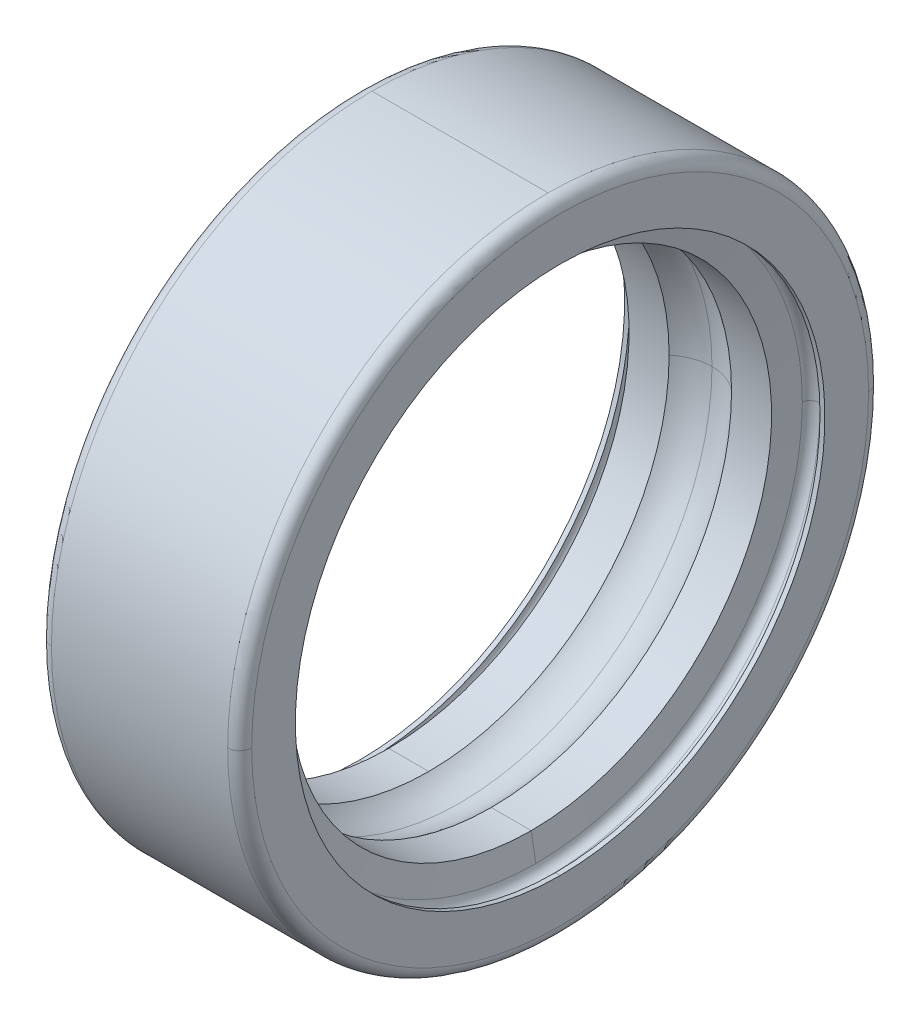
ISO-10303-21;
HEADER;
FILE_DESCRIPTION(('STEP AP214'),'2;1');
FILE_NAME('part.step','',(''),(''),'','','');
FILE_SCHEMA(('AUTOMOTIVE_DESIGN { 1 0 10303 214 1 1 1 1 }'));
ENDSEC;
DATA;
#1=APPLICATION_CONTEXT('core data for automotive mechanical design processes');
#2=APPLICATION_PROTOCOL_DEFINITION('international standard','automotive_design',2000,#1);
#3=PRODUCT_CONTEXT('',#1,'mechanical');
#4=PRODUCT('Part','Part','',(#3));
#5=PRODUCT_RELATED_PRODUCT_CATEGORY('part','',(#4));
#6=PRODUCT_DEFINITION_FORMATION('','',#4);
#7=PRODUCT_DEFINITION_CONTEXT('part definition',#1,'design');
#8=PRODUCT_DEFINITION('design','',#6,#7);
#9=PRODUCT_DEFINITION_SHAPE('','',#8);
#10=(LENGTH_UNIT() NAMED_UNIT(*) SI_UNIT(.MILLI.,.METRE.));
#11=(NAMED_UNIT(*) PLANE_ANGLE_UNIT() SI_UNIT($,.RADIAN.));
#12=(NAMED_UNIT(*) SI_UNIT($,.STERADIAN.) SOLID_ANGLE_UNIT());
#13=UNCERTAINTY_MEASURE_WITH_UNIT(LENGTH_MEASURE(1.E-05),#10,'distance_accuracy_value','');
#14=(GEOMETRIC_REPRESENTATION_CONTEXT(3) GLOBAL_UNCERTAINTY_ASSIGNED_CONTEXT((#13)) GLOBAL_UNIT_ASSIGNED_CONTEXT((#10,
#11,#12)) REPRESENTATION_CONTEXT('',''));
#15=CARTESIAN_POINT('',(0.,0.,0.));
#16=DIRECTION('',(0.,0.,1.));
#17=DIRECTION('',(1.,0.,0.));
#18=AXIS2_PLACEMENT_3D('',#15,#16,#17);
#19=CARTESIAN_POINT('',(4.634,0.,0.));
#20=DIRECTION('',(1.,0.,0.));
#21=DIRECTION('',(0.,0.,-1.));
#22=AXIS2_PLACEMENT_3D('',#19,#20,#21);
#23=TOROIDAL_SURFACE('',#22,6.61,0.244);
#24=CARTESIAN_POINT('',(4.634,0.,0.));
#25=DIRECTION('',(1.,0.,0.));
#26=DIRECTION('',(0.,0.,1.));
#27=AXIS2_PLACEMENT_3D('',#24,#25,#26);
#28=CIRCLE('',#27,6.854);
#29=CARTESIAN_POINT('',(4.634,0.,-6.854));
#30=VERTEX_POINT('',#29);
#31=CARTESIAN_POINT('',(4.634,0.,6.854));
#32=VERTEX_POINT('',#31);
#33=EDGE_CURVE('E184',#30,#32,#28,.T.);
#34=ORIENTED_EDGE('',*,*,#33,.T.);
#35=CARTESIAN_POINT('',(4.634,0.,6.61));
#36=DIRECTION('',(0.,-1.,0.));
#37=DIRECTION('',(0.,0.,1.));
#38=AXIS2_PLACEMENT_3D('',#35,#36,#37);
#39=CIRCLE('',#38,0.244);
#40=CARTESIAN_POINT('',(4.39370690826502,0.,6.65237015535073));
#41=VERTEX_POINT('',#40);
#42=EDGE_CURVE('E197',#32,#41,#39,.T.);
#43=ORIENTED_EDGE('',*,*,#42,.T.);
#44=CARTESIAN_POINT('',(4.39370690826502,0.,0.));
#45=DIRECTION('',(1.,0.,0.));
#46=DIRECTION('',(0.,1.,0.));
#47=AXIS2_PLACEMENT_3D('',#44,#45,#46);
#48=CIRCLE('',#47,6.65237015535073);
#49=CARTESIAN_POINT('',(4.39370690826502,6.65237015535073,0.));
#50=VERTEX_POINT('',#49);
#51=EDGE_CURVE('E31',#50,#41,#48,.T.);
#52=ORIENTED_EDGE('',*,*,#51,.F.);
#53=CARTESIAN_POINT('',(4.39370690826502,0.,0.));
#54=DIRECTION('',(1.,0.,0.));
#55=DIRECTION('',(0.,1.,0.));
#56=AXIS2_PLACEMENT_3D('',#53,#54,#55);
#57=CIRCLE('',#56,6.65237015535073);
#58=CARTESIAN_POINT('',(4.39370690826502,0.,-6.65237015535073));
#59=VERTEX_POINT('',#58);
#60=EDGE_CURVE('E185',#59,#50,#57,.T.);
#61=ORIENTED_EDGE('',*,*,#60,.F.);
#62=CARTESIAN_POINT('',(4.634,0.,-6.61));
#63=DIRECTION('',(0.,-1.,0.));
#64=DIRECTION('',(0.,0.,-1.));
#65=AXIS2_PLACEMENT_3D('',#62,#63,#64);
#66=CIRCLE('',#65,0.244);
#67=EDGE_CURVE('E181',#59,#30,#66,.T.);
#68=ORIENTED_EDGE('',*,*,#67,.T.);
#69=EDGE_LOOP('',(#34,#43,#52,#61,#68));
#70=FACE_BOUND('',#69,.T.);
#71=ADVANCED_FACE('F16',(#70),#23,.F.);
#72=CARTESIAN_POINT('',(4.939,0.,0.));
#73=DIRECTION('',(1.,0.,0.));
#74=DIRECTION('',(0.,1.,0.));
#75=AXIS2_PLACEMENT_3D('',#72,#73,#74);
#76=CYLINDRICAL_SURFACE('',#75,6.61);
#77=DIRECTION('',(1.,0.,0.));
#78=VECTOR('',#77,1.);
#79=CARTESIAN_POINT('',(4.939,6.61,0.));
#80=LINE('',#79,#78);
#81=CARTESIAN_POINT('',(4.878,6.61,0.));
#82=VERTEX_POINT('',#81);
#83=CARTESIAN_POINT('',(5.,6.61,0.));
#84=VERTEX_POINT('',#83);
#85=EDGE_CURVE('E310',#82,#84,#80,.T.);
#86=ORIENTED_EDGE('',*,*,#85,.T.);
#87=CARTESIAN_POINT('',(5.,0.,0.));
#88=DIRECTION('',(1.,0.,0.));
#89=DIRECTION('',(0.,1.,0.));
#90=AXIS2_PLACEMENT_3D('',#87,#88,#89);
#91=CIRCLE('',#90,6.61);
#92=CARTESIAN_POINT('',(5.,-6.61,0.));
#93=VERTEX_POINT('',#92);
#94=EDGE_CURVE('E11',#84,#93,#91,.T.);
#95=ORIENTED_EDGE('',*,*,#94,.T.);
#96=DIRECTION('',(-1.,0.,0.));
#97=VECTOR('',#96,1.);
#98=CARTESIAN_POINT('',(4.939,-6.61,0.));
#99=LINE('',#98,#97);
#100=CARTESIAN_POINT('',(4.878,-6.61,0.));
#101=VERTEX_POINT('',#100);
#102=EDGE_CURVE('E313',#93,#101,#99,.T.);
#103=ORIENTED_EDGE('',*,*,#102,.T.);
#104=CARTESIAN_POINT('',(4.878,0.,0.));
#105=DIRECTION('',(1.,0.,0.));
#106=DIRECTION('',(0.,1.,0.));
#107=AXIS2_PLACEMENT_3D('',#104,#105,#106);
#108=CIRCLE('',#107,6.61);
#109=CARTESIAN_POINT('',(4.878,0.,6.61));
#110=VERTEX_POINT('',#109);
#111=EDGE_CURVE('E201',#110,#101,#108,.T.);
#112=ORIENTED_EDGE('',*,*,#111,.F.);
#113=CARTESIAN_POINT('',(4.878,0.,0.));
#114=DIRECTION('',(1.,0.,0.));
#115=DIRECTION('',(0.,1.,0.));
#116=AXIS2_PLACEMENT_3D('',#113,#114,#115);
#117=CIRCLE('',#116,6.61);
#118=EDGE_CURVE('E244',#82,#110,#117,.T.);
#119=ORIENTED_EDGE('',*,*,#118,.F.);
#120=EDGE_LOOP('',(#86,#95,#103,#112,#119));
#121=FACE_BOUND('',#120,.T.);
#122=ADVANCED_FACE('F18',(#121),#76,.F.);
#123=CARTESIAN_POINT('',(5.,7.155,0.));
#124=DIRECTION('',(1.,0.,0.));
#125=DIRECTION('',(0.,1.,0.));
#126=AXIS2_PLACEMENT_3D('',#123,#124,#125);
#127=PLANE('',#126);
#128=ORIENTED_EDGE('',*,*,#94,.F.);
#129=CARTESIAN_POINT('',(5.,0.,0.));
#130=DIRECTION('',(1.,0.,0.));
#131=DIRECTION('',(0.,1.,0.));
#132=AXIS2_PLACEMENT_3D('',#129,#130,#131);
#133=CIRCLE('',#132,6.61);
#134=EDGE_CURVE('E315',#93,#84,#133,.T.);
#135=ORIENTED_EDGE('',*,*,#134,.F.);
#136=EDGE_LOOP('',(#128,#135));
#137=FACE_BOUND('',#136,.T.);
#138=CARTESIAN_POINT('',(5.,0.,0.));
#139=DIRECTION('',(1.,0.,0.));
#140=DIRECTION('',(0.,1.,0.));
#141=AXIS2_PLACEMENT_3D('',#138,#139,#140);
#142=CIRCLE('',#141,7.7);
#143=CARTESIAN_POINT('',(5.,0.,7.7));
#144=VERTEX_POINT('',#143);
#145=CARTESIAN_POINT('',(5.,0.,-7.7));
#146=VERTEX_POINT('',#145);
#147=EDGE_CURVE('E24',#144,#146,#142,.T.);
#148=ORIENTED_EDGE('',*,*,#147,.T.);
#149=CARTESIAN_POINT('',(5.,0.,0.));
#150=DIRECTION('',(1.,0.,0.));
#151=DIRECTION('',(0.,1.,0.));
#152=AXIS2_PLACEMENT_3D('',#149,#150,#151);
#153=CIRCLE('',#152,7.7);
#154=EDGE_CURVE('E323',#146,#144,#153,.T.);
#155=ORIENTED_EDGE('',*,*,#154,.T.);
#156=EDGE_LOOP('',(#148,#155));
#157=FACE_BOUND('',#156,.T.);
#158=ADVANCED_FACE('F401',(#137,#157),#127,.T.);
#159=CARTESIAN_POINT('',(4.7,0.,0.));
#160=DIRECTION('',(1.,0.,0.));
#161=DIRECTION('',(0.,0.,-1.));
#162=AXIS2_PLACEMENT_3D('',#159,#160,#161);
#163=TOROIDAL_SURFACE('',#162,7.7,0.3);
#164=CARTESIAN_POINT('',(4.7,0.,-7.7));
#165=DIRECTION('',(0.,-1.,0.));
#166=DIRECTION('',(0.,0.,-1.));
#167=AXIS2_PLACEMENT_3D('',#164,#165,#166);
#168=CIRCLE('',#167,0.3);
#169=CARTESIAN_POINT('',(4.7,0.,-8.));
#170=VERTEX_POINT('',#169);
#171=EDGE_CURVE('E242',#170,#146,#168,.T.);
#172=ORIENTED_EDGE('',*,*,#171,.T.);
#173=ORIENTED_EDGE('',*,*,#147,.F.);
#174=CARTESIAN_POINT('',(4.7,0.,7.7));
#175=DIRECTION('',(0.,-1.,0.));
#176=DIRECTION('',(0.,0.,1.));
#177=AXIS2_PLACEMENT_3D('',#174,#175,#176);
#178=CIRCLE('',#177,0.3);
#179=CARTESIAN_POINT('',(4.7,0.,8.));
#180=VERTEX_POINT('',#179);
#181=EDGE_CURVE('E320',#144,#180,#178,.T.);
#182=ORIENTED_EDGE('',*,*,#181,.T.);
#183=CARTESIAN_POINT('',(4.7,0.,0.));
#184=DIRECTION('',(1.,0.,0.));
#185=DIRECTION('',(0.,1.,0.));
#186=AXIS2_PLACEMENT_3D('',#183,#184,#185);
#187=CIRCLE('',#186,8.);
#188=CARTESIAN_POINT('',(4.7,-8.,0.));
#189=VERTEX_POINT('',#188);
#190=EDGE_CURVE('E337',#180,#189,#187,.T.);
#191=ORIENTED_EDGE('',*,*,#190,.T.);
#192=CARTESIAN_POINT('',(4.7,0.,0.));
#193=DIRECTION('',(1.,0.,0.));
#194=DIRECTION('',(0.,1.,0.));
#195=AXIS2_PLACEMENT_3D('',#192,#193,#194);
#196=CIRCLE('',#195,8.);
#197=EDGE_CURVE('E398',#189,#170,#196,.T.);
#198=ORIENTED_EDGE('',*,*,#197,.T.);
#199=EDGE_LOOP('',(#172,#173,#182,#191,#198));
#200=FACE_BOUND('',#199,.T.);
#201=ADVANCED_FACE('F408',(#200),#163,.T.);
#202=CARTESIAN_POINT('',(2.5,0.,0.));
#203=DIRECTION('',(1.,0.,0.));
#204=DIRECTION('',(0.,1.,0.));
#205=AXIS2_PLACEMENT_3D('',#202,#203,#204);
#206=CYLINDRICAL_SURFACE('',#205,8.);
#207=DIRECTION('',(1.,0.,0.));
#208=VECTOR('',#207,1.);
#209=CARTESIAN_POINT('',(2.5,8.,0.));
#210=LINE('',#209,#208);
#211=CARTESIAN_POINT('',(0.3,8.,0.));
#212=VERTEX_POINT('',#211);
#213=CARTESIAN_POINT('',(4.7,8.,0.));
#214=VERTEX_POINT('',#213);
#215=EDGE_CURVE('E326',#212,#214,#210,.T.);
#216=ORIENTED_EDGE('',*,*,#215,.T.);
#217=CARTESIAN_POINT('',(4.7,0.,0.));
#218=DIRECTION('',(1.,0.,0.));
#219=DIRECTION('',(0.,1.,0.));
#220=AXIS2_PLACEMENT_3D('',#217,#218,#219);
#221=CIRCLE('',#220,8.);
#222=EDGE_CURVE('E239',#170,#214,#221,.T.);
#223=ORIENTED_EDGE('',*,*,#222,.F.);
#224=ORIENTED_EDGE('',*,*,#197,.F.);
#225=DIRECTION('',(-1.,0.,0.));
#226=VECTOR('',#225,1.);
#227=CARTESIAN_POINT('',(2.5,-8.,0.));
#228=LINE('',#227,#226);
#229=CARTESIAN_POINT('',(0.3,-8.,0.));
#230=VERTEX_POINT('',#229);
#231=EDGE_CURVE('E334',#189,#230,#228,.T.);
#232=ORIENTED_EDGE('',*,*,#231,.T.);
#233=CARTESIAN_POINT('',(0.3,0.,0.));
#234=DIRECTION('',(1.,0.,0.));
#235=DIRECTION('',(0.,1.,0.));
#236=AXIS2_PLACEMENT_3D('',#233,#234,#235);
#237=CIRCLE('',#236,8.);
#238=CARTESIAN_POINT('',(0.3,0.,-8.));
#239=VERTEX_POINT('',#238);
#240=EDGE_CURVE('E356',#230,#239,#237,.T.);
#241=ORIENTED_EDGE('',*,*,#240,.T.);
#242=CARTESIAN_POINT('',(0.3,0.,0.));
#243=DIRECTION('',(1.,0.,0.));
#244=DIRECTION('',(0.,1.,0.));
#245=AXIS2_PLACEMENT_3D('',#242,#243,#244);
#246=CIRCLE('',#245,8.);
#247=EDGE_CURVE('E345',#239,#212,#246,.T.);
#248=ORIENTED_EDGE('',*,*,#247,.T.);
#249=EDGE_LOOP('',(#216,#223,#224,#232,#241,#248));
#250=FACE_BOUND('',#249,.T.);
#251=ADVANCED_FACE('F412',(#250),#206,.T.);
#252=CARTESIAN_POINT('',(0.3,0.,0.));
#253=DIRECTION('',(1.,0.,0.));
#254=DIRECTION('',(0.,0.,-1.));
#255=AXIS2_PLACEMENT_3D('',#252,#253,#254);
#256=TOROIDAL_SURFACE('',#255,7.7,0.3);
#257=CARTESIAN_POINT('',(0.3,0.,-7.7));
#258=DIRECTION('',(0.,-1.,0.));
#259=DIRECTION('',(0.,0.,-1.));
#260=AXIS2_PLACEMENT_3D('',#257,#258,#259);
#261=CIRCLE('',#260,0.3);
#262=CARTESIAN_POINT('',(0.,0.,-7.7));
#263=VERTEX_POINT('',#262);
#264=EDGE_CURVE('E235',#263,#239,#261,.T.);
#265=ORIENTED_EDGE('',*,*,#264,.T.);
#266=ORIENTED_EDGE('',*,*,#240,.F.);
#267=CARTESIAN_POINT('',(0.3,0.,0.));
#268=DIRECTION('',(1.,0.,0.));
#269=DIRECTION('',(0.,1.,0.));
#270=AXIS2_PLACEMENT_3D('',#267,#268,#269);
#271=CIRCLE('',#270,8.);
#272=CARTESIAN_POINT('',(0.3,0.,8.));
#273=VERTEX_POINT('',#272);
#274=EDGE_CURVE('E331',#273,#230,#271,.T.);
#275=ORIENTED_EDGE('',*,*,#274,.F.);
#276=CARTESIAN_POINT('',(0.3,0.,7.7));
#277=DIRECTION('',(0.,-1.,0.));
#278=DIRECTION('',(0.,0.,1.));
#279=AXIS2_PLACEMENT_3D('',#276,#277,#278);
#280=CIRCLE('',#279,0.3);
#281=CARTESIAN_POINT('',(0.,0.,7.7));
#282=VERTEX_POINT('',#281);
#283=EDGE_CURVE('E234',#273,#282,#280,.T.);
#284=ORIENTED_EDGE('',*,*,#283,.T.);
#285=CARTESIAN_POINT('',(0.,0.,0.));
#286=DIRECTION('',(1.,0.,0.));
#287=DIRECTION('',(0.,1.,0.));
#288=AXIS2_PLACEMENT_3D('',#285,#286,#287);
#289=CIRCLE('',#288,7.7);
#290=EDGE_CURVE('E351',#282,#263,#289,.T.);
#291=ORIENTED_EDGE('',*,*,#290,.T.);
#292=EDGE_LOOP('',(#265,#266,#275,#284,#291));
#293=FACE_BOUND('',#292,.T.);
#294=ADVANCED_FACE('F424',(#293),#256,.T.);
#295=CARTESIAN_POINT('',(0.,7.155,0.));
#296=DIRECTION('',(-1.,0.,0.));
#297=DIRECTION('',(0.,0.,1.));
#298=AXIS2_PLACEMENT_3D('',#295,#296,#297);
#299=PLANE('',#298);
#300=CARTESIAN_POINT('',(0.,0.,0.));
#301=DIRECTION('',(1.,0.,0.));
#302=DIRECTION('',(0.,1.,0.));
#303=AXIS2_PLACEMENT_3D('',#300,#301,#302);
#304=CIRCLE('',#303,6.61);
#305=CARTESIAN_POINT('',(0.,6.61,0.));
#306=VERTEX_POINT('',#305);
#307=CARTESIAN_POINT('',(0.,-6.61,0.));
#308=VERTEX_POINT('',#307);
#309=EDGE_CURVE('E347',#306,#308,#304,.T.);
#310=ORIENTED_EDGE('',*,*,#309,.T.);
#311=CARTESIAN_POINT('',(0.,0.,0.));
#312=DIRECTION('',(1.,0.,0.));
#313=DIRECTION('',(0.,1.,0.));
#314=AXIS2_PLACEMENT_3D('',#311,#312,#313);
#315=CIRCLE('',#314,6.61);
#316=EDGE_CURVE('E354',#308,#306,#315,.T.);
#317=ORIENTED_EDGE('',*,*,#316,.T.);
#318=EDGE_LOOP('',(#310,#317));
#319=FACE_BOUND('',#318,.T.);
#320=CARTESIAN_POINT('',(0.,0.,0.));
#321=DIRECTION('',(1.,0.,0.));
#322=DIRECTION('',(0.,1.,0.));
#323=AXIS2_PLACEMENT_3D('',#320,#321,#322);
#324=CIRCLE('',#323,7.7);
#325=EDGE_CURVE('E231',#263,#282,#324,.T.);
#326=ORIENTED_EDGE('',*,*,#325,.F.);
#327=ORIENTED_EDGE('',*,*,#290,.F.);
#328=EDGE_LOOP('',(#326,#327));
#329=FACE_BOUND('',#328,.T.);
#330=ADVANCED_FACE('F427',(#319,#329),#299,.T.);
#331=CARTESIAN_POINT('',(0.061,0.,0.));
#332=DIRECTION('',(1.,0.,0.));
#333=DIRECTION('',(0.,1.,0.));
#334=AXIS2_PLACEMENT_3D('',#331,#332,#333);
#335=CYLINDRICAL_SURFACE('',#334,6.61);
#336=DIRECTION('',(1.,0.,0.));
#337=VECTOR('',#336,1.);
#338=CARTESIAN_POINT('',(0.061,6.61,0.));
#339=LINE('',#338,#337);
#340=CARTESIAN_POINT('',(0.122,6.61,0.));
#341=VERTEX_POINT('',#340);
#342=EDGE_CURVE('E349',#306,#341,#339,.T.);
#343=ORIENTED_EDGE('',*,*,#342,.T.);
#344=CARTESIAN_POINT('',(0.122,0.,0.));
#345=DIRECTION('',(1.,0.,0.));
#346=DIRECTION('',(0.,1.,0.));
#347=AXIS2_PLACEMENT_3D('',#344,#345,#346);
#348=CIRCLE('',#347,6.61);
#349=CARTESIAN_POINT('',(0.122,0.,6.61));
#350=VERTEX_POINT('',#349);
#351=EDGE_CURVE('E230',#341,#350,#348,.T.);
#352=ORIENTED_EDGE('',*,*,#351,.T.);
#353=CARTESIAN_POINT('',(0.122,0.,0.));
#354=DIRECTION('',(1.,0.,0.));
#355=DIRECTION('',(0.,1.,0.));
#356=AXIS2_PLACEMENT_3D('',#353,#354,#355);
#357=CIRCLE('',#356,6.61);
#358=CARTESIAN_POINT('',(0.122,-6.61,0.));
#359=VERTEX_POINT('',#358);
#360=EDGE_CURVE('E370',#350,#359,#357,.T.);
#361=ORIENTED_EDGE('',*,*,#360,.T.);
#362=DIRECTION('',(-1.,0.,0.));
#363=VECTOR('',#362,1.);
#364=CARTESIAN_POINT('',(0.061,-6.61,0.));
#365=LINE('',#364,#363);
#366=EDGE_CURVE('E359',#359,#308,#365,.T.);
#367=ORIENTED_EDGE('',*,*,#366,.T.);
#368=ORIENTED_EDGE('',*,*,#309,.F.);
#369=EDGE_LOOP('',(#343,#352,#361,#367,#368));
#370=FACE_BOUND('',#369,.T.);
#371=ADVANCED_FACE('F429',(#370),#335,.F.);
#372=CARTESIAN_POINT('',(0.366,0.,0.));
#373=DIRECTION('',(1.,0.,0.));
#374=DIRECTION('',(0.,0.,-1.));
#375=AXIS2_PLACEMENT_3D('',#372,#373,#374);
#376=TOROIDAL_SURFACE('',#375,6.61,0.244);
#377=CARTESIAN_POINT('',(0.366,0.,0.));
#378=DIRECTION('',(1.,0.,0.));
#379=DIRECTION('',(0.,0.,1.));
#380=AXIS2_PLACEMENT_3D('',#377,#378,#379);
#381=CIRCLE('',#380,6.854);
#382=CARTESIAN_POINT('',(0.366,0.,-6.854));
#383=VERTEX_POINT('',#382);
#384=CARTESIAN_POINT('',(0.366,0.,6.854));
#385=VERTEX_POINT('',#384);
#386=EDGE_CURVE('E257',#383,#385,#381,.T.);
#387=ORIENTED_EDGE('',*,*,#386,.T.);
#388=CARTESIAN_POINT('',(0.366,0.,6.61));
#389=DIRECTION('',(0.,-1.,0.));
#390=DIRECTION('',(0.,0.,1.));
#391=AXIS2_PLACEMENT_3D('',#388,#389,#390);
#392=CIRCLE('',#391,0.244);
#393=EDGE_CURVE('E372',#385,#350,#392,.T.);
#394=ORIENTED_EDGE('',*,*,#393,.T.);
#395=ORIENTED_EDGE('',*,*,#351,.F.);
#396=CARTESIAN_POINT('',(0.122,0.,0.));
#397=DIRECTION('',(1.,0.,0.));
#398=DIRECTION('',(0.,1.,0.));
#399=AXIS2_PLACEMENT_3D('',#396,#397,#398);
#400=CIRCLE('',#399,6.61);
#401=CARTESIAN_POINT('',(0.122,0.,-6.61));
#402=VERTEX_POINT('',#401);
#403=EDGE_CURVE('E365',#402,#341,#400,.T.);
#404=ORIENTED_EDGE('',*,*,#403,.F.);
#405=CARTESIAN_POINT('',(0.366,0.,-6.61));
#406=DIRECTION('',(0.,-1.,0.));
#407=DIRECTION('',(0.,0.,-1.));
#408=AXIS2_PLACEMENT_3D('',#405,#406,#407);
#409=CIRCLE('',#408,0.244);
#410=EDGE_CURVE('E368',#402,#383,#409,.T.);
#411=ORIENTED_EDGE('',*,*,#410,.T.);
#412=EDGE_LOOP('',(#387,#394,#395,#404,#411));
#413=FACE_BOUND('',#412,.T.);
#414=ADVANCED_FACE('F437',(#413),#376,.F.);
#415=CARTESIAN_POINT('',(0.663808321633632,0.,0.));
#416=DIRECTION('',(-1.,0.,0.));
#417=DIRECTION('',(0.,1.,0.));
#418=AXIS2_PLACEMENT_3D('',#415,#416,#417);
#419=CONICAL_SURFACE('',#418,6.32618507767537,1.39626340159546);
#420=DIRECTION('',(0.173648177666931,-0.984807753012208,0.));
#421=VECTOR('',#420,1.);
#422=CARTESIAN_POINT('',(0.663808321633632,6.32618507767536,0.));
#423=LINE('',#422,#421);
#424=CARTESIAN_POINT('',(0.606293091734979,6.65237015535073,0.));
#425=VERTEX_POINT('',#424);
#426=CARTESIAN_POINT('',(0.721323551532286,6.,0.));
#427=VERTEX_POINT('',#426);
#428=EDGE_CURVE('E267',#425,#427,#423,.T.);
#429=ORIENTED_EDGE('',*,*,#428,.T.);
#430=CARTESIAN_POINT('',(0.721323551532286,0.,0.));
#431=DIRECTION('',(1.,0.,0.));
#432=DIRECTION('',(0.,1.,0.));
#433=AXIS2_PLACEMENT_3D('',#430,#431,#432);
#434=CIRCLE('',#433,6.);
#435=CARTESIAN_POINT('',(0.721323551532286,-6.,0.));
#436=VERTEX_POINT('',#435);
#437=EDGE_CURVE('E228',#427,#436,#434,.T.);
#438=ORIENTED_EDGE('',*,*,#437,.T.);
#439=DIRECTION('',(-0.173648177666931,-0.984807753012208,0.));
#440=VECTOR('',#439,1.);
#441=CARTESIAN_POINT('',(0.663808321633632,-6.32618507767536,0.));
#442=LINE('',#441,#440);
#443=CARTESIAN_POINT('',(0.606293091734979,-6.65237015535073,0.));
#444=VERTEX_POINT('',#443);
#445=EDGE_CURVE('E264',#436,#444,#442,.T.);
#446=ORIENTED_EDGE('',*,*,#445,.T.);
#447=CARTESIAN_POINT('',(0.606293091734979,0.,0.));
#448=DIRECTION('',(1.,0.,0.));
#449=DIRECTION('',(0.,1.,0.));
#450=AXIS2_PLACEMENT_3D('',#447,#448,#449);
#451=CIRCLE('',#450,6.65237015535073);
#452=CARTESIAN_POINT('',(0.606293091734979,0.,6.65237015535073));
#453=VERTEX_POINT('',#452);
#454=EDGE_CURVE('E292',#453,#444,#451,.T.);
#455=ORIENTED_EDGE('',*,*,#454,.F.);
#456=CARTESIAN_POINT('',(0.606293091734979,0.,0.));
#457=DIRECTION('',(1.,0.,0.));
#458=DIRECTION('',(0.,1.,0.));
#459=AXIS2_PLACEMENT_3D('',#456,#457,#458);
#460=CIRCLE('',#459,6.65237015535073);
#461=EDGE_CURVE('E270',#425,#453,#460,.T.);
#462=ORIENTED_EDGE('',*,*,#461,.F.);
#463=EDGE_LOOP('',(#429,#438,#446,#455,#462));
#464=FACE_BOUND('',#463,.T.);
#465=ADVANCED_FACE('F478',(#464),#419,.F.);
#466=CARTESIAN_POINT('',(1.22101762721519,0.,0.));
#467=DIRECTION('',(1.,0.,0.));
#468=DIRECTION('',(0.,1.,0.));
#469=AXIS2_PLACEMENT_3D('',#466,#467,#468);
#470=CYLINDRICAL_SURFACE('',#469,6.);
#471=DIRECTION('',(1.,0.,0.));
#472=VECTOR('',#471,1.);
#473=CARTESIAN_POINT('',(1.22101762721519,6.,0.));
#474=LINE('',#473,#472);
#475=CARTESIAN_POINT('',(1.72071170289809,6.,0.));
#476=VERTEX_POINT('',#475);
#477=EDGE_CURVE('E379',#427,#476,#474,.T.);
#478=ORIENTED_EDGE('',*,*,#477,.T.);
#479=CARTESIAN_POINT('',(1.72071170289809,0.,0.));
#480=DIRECTION('',(1.,0.,0.));
#481=DIRECTION('',(0.,1.,0.));
#482=AXIS2_PLACEMENT_3D('',#479,#480,#481);
#483=CIRCLE('',#482,6.);
#484=CARTESIAN_POINT('',(1.72071170289809,0.,6.));
#485=VERTEX_POINT('',#484);
#486=EDGE_CURVE('E226',#476,#485,#483,.T.);
#487=ORIENTED_EDGE('',*,*,#486,.T.);
#488=CARTESIAN_POINT('',(1.72071170289809,0.,0.));
#489=DIRECTION('',(1.,0.,0.));
#490=DIRECTION('',(0.,1.,0.));
#491=AXIS2_PLACEMENT_3D('',#488,#489,#490);
#492=CIRCLE('',#491,6.);
#493=CARTESIAN_POINT('',(1.72071170289809,-6.,0.));
#494=VERTEX_POINT('',#493);
#495=EDGE_CURVE('E250',#485,#494,#492,.T.);
#496=ORIENTED_EDGE('',*,*,#495,.T.);
#497=DIRECTION('',(-1.,0.,0.));
#498=VECTOR('',#497,1.);
#499=CARTESIAN_POINT('',(1.22101762721519,-6.,0.));
#500=LINE('',#499,#498);
#501=EDGE_CURVE('E289',#494,#436,#500,.T.);
#502=ORIENTED_EDGE('',*,*,#501,.T.);
#503=ORIENTED_EDGE('',*,*,#437,.F.);
#504=EDGE_LOOP('',(#478,#487,#496,#502,#503));
#505=FACE_BOUND('',#504,.T.);
#506=ADVANCED_FACE('F475',(#505),#470,.F.);
#507=CARTESIAN_POINT('',(2.5,0.,0.));
#508=DIRECTION('',(1.,0.,0.));
#509=DIRECTION('',(0.,0.,-1.));
#510=AXIS2_PLACEMENT_3D('',#507,#508,#509);
#511=TOROIDAL_SURFACE('',#510,5.1,1.1905);
#512=CARTESIAN_POINT('',(2.5,0.,0.));
#513=DIRECTION('',(1.,0.,0.));
#514=DIRECTION('',(0.,0.,1.));
#515=AXIS2_PLACEMENT_3D('',#512,#513,#514);
#516=CIRCLE('',#515,6.2905);
#517=CARTESIAN_POINT('',(2.5,0.,-6.2905));
#518=VERTEX_POINT('',#517);
#519=CARTESIAN_POINT('',(2.5,0.,6.2905));
#520=VERTEX_POINT('',#519);
#521=EDGE_CURVE('E255',#518,#520,#516,.T.);
#522=ORIENTED_EDGE('',*,*,#521,.T.);
#523=CARTESIAN_POINT('',(2.5,0.,5.1));
#524=DIRECTION('',(0.,-1.,0.));
#525=DIRECTION('',(0.,0.,1.));
#526=AXIS2_PLACEMENT_3D('',#523,#524,#525);
#527=CIRCLE('',#526,1.1905);
#528=EDGE_CURVE('E302',#520,#485,#527,.T.);
#529=ORIENTED_EDGE('',*,*,#528,.T.);
#530=ORIENTED_EDGE('',*,*,#486,.F.);
#531=CARTESIAN_POINT('',(1.72071170289809,0.,0.));
#532=DIRECTION('',(1.,0.,0.));
#533=DIRECTION('',(0.,1.,0.));
#534=AXIS2_PLACEMENT_3D('',#531,#532,#533);
#535=CIRCLE('',#534,6.);
#536=CARTESIAN_POINT('',(1.72071170289809,0.,-6.));
#537=VERTEX_POINT('',#536);
#538=EDGE_CURVE('E251',#537,#476,#535,.T.);
#539=ORIENTED_EDGE('',*,*,#538,.F.);
#540=CARTESIAN_POINT('',(2.5,0.,-5.1));
#541=DIRECTION('',(0.,-1.,0.));
#542=DIRECTION('',(0.,0.,-1.));
#543=AXIS2_PLACEMENT_3D('',#540,#541,#542);
#544=CIRCLE('',#543,1.1905);
#545=EDGE_CURVE('E248',#537,#518,#544,.T.);
#546=ORIENTED_EDGE('',*,*,#545,.T.);
#547=EDGE_LOOP('',(#522,#529,#530,#539,#546));
#548=FACE_BOUND('',#547,.T.);
#549=ADVANCED_FACE('F474',(#548),#511,.F.);
#550=CARTESIAN_POINT('',(3.77898237278481,0.,0.));
#551=DIRECTION('',(1.,0.,0.));
#552=DIRECTION('',(0.,1.,0.));
#553=AXIS2_PLACEMENT_3D('',#550,#551,#552);
#554=CYLINDRICAL_SURFACE('',#553,6.);
#555=DIRECTION('',(1.,0.,0.));
#556=VECTOR('',#555,1.);
#557=CARTESIAN_POINT('',(3.77898237278481,6.,0.));
#558=LINE('',#557,#556);
#559=CARTESIAN_POINT('',(3.27928829710191,6.,0.));
#560=VERTEX_POINT('',#559);
#561=CARTESIAN_POINT('',(4.27867644846771,6.,0.));
#562=VERTEX_POINT('',#561);
#563=EDGE_CURVE('E299',#560,#562,#558,.T.);
#564=ORIENTED_EDGE('',*,*,#563,.T.);
#565=CARTESIAN_POINT('',(4.27867644846771,0.,0.));
#566=DIRECTION('',(1.,0.,0.));
#567=DIRECTION('',(0.,1.,0.));
#568=AXIS2_PLACEMENT_3D('',#565,#566,#567);
#569=CIRCLE('',#568,6.);
#570=CARTESIAN_POINT('',(4.27867644846772,-6.,0.));
#571=VERTEX_POINT('',#570);
#572=EDGE_CURVE('E39',#562,#571,#569,.T.);
#573=ORIENTED_EDGE('',*,*,#572,.T.);
#574=DIRECTION('',(-1.,0.,0.));
#575=VECTOR('',#574,1.);
#576=CARTESIAN_POINT('',(3.77898237278481,-6.,0.));
#577=LINE('',#576,#575);
#578=CARTESIAN_POINT('',(3.27928829710191,-6.,0.));
#579=VERTEX_POINT('',#578);
#580=EDGE_CURVE('E296',#571,#579,#577,.T.);
#581=ORIENTED_EDGE('',*,*,#580,.T.);
#582=CARTESIAN_POINT('',(3.27928829710191,0.,0.));
#583=DIRECTION('',(1.,0.,0.));
#584=DIRECTION('',(0.,1.,0.));
#585=AXIS2_PLACEMENT_3D('',#582,#583,#584);
#586=CIRCLE('',#585,6.);
#587=CARTESIAN_POINT('',(3.27928829710191,0.,6.));
#588=VERTEX_POINT('',#587);
#589=EDGE_CURVE('E280',#588,#579,#586,.T.);
#590=ORIENTED_EDGE('',*,*,#589,.F.);
#591=CARTESIAN_POINT('',(3.27928829710191,0.,0.));
#592=DIRECTION('',(1.,0.,0.));
#593=DIRECTION('',(0.,1.,0.));
#594=AXIS2_PLACEMENT_3D('',#591,#592,#593);
#595=CIRCLE('',#594,6.);
#596=EDGE_CURVE('E224',#560,#588,#595,.T.);
#597=ORIENTED_EDGE('',*,*,#596,.F.);
#598=EDGE_LOOP('',(#564,#573,#581,#590,#597));
#599=FACE_BOUND('',#598,.T.);
#600=ADVANCED_FACE('F470',(#599),#554,.F.);
#601=CARTESIAN_POINT('',(4.33619167836637,0.,0.));
#602=DIRECTION('',(1.,0.,0.));
#603=DIRECTION('',(0.,1.,0.));
#604=AXIS2_PLACEMENT_3D('',#601,#602,#603);
#605=CONICAL_SURFACE('',#604,6.32618507767537,1.39626340159546);
#606=DIRECTION('',(0.173648177666929,0.984807753012208,0.));
#607=VECTOR('',#606,1.);
#608=CARTESIAN_POINT('',(4.33619167836637,6.32618507767537,0.));
#609=LINE('',#608,#607);
#610=EDGE_CURVE('E390',#562,#50,#609,.T.);
#611=ORIENTED_EDGE('',*,*,#610,.T.);
#612=ORIENTED_EDGE('',*,*,#51,.T.);
#613=CARTESIAN_POINT('',(4.39370690826502,0.,0.));
#614=DIRECTION('',(1.,0.,0.));
#615=DIRECTION('',(0.,1.,0.));
#616=AXIS2_PLACEMENT_3D('',#613,#614,#615);
#617=CIRCLE('',#616,6.65237015535073);
#618=CARTESIAN_POINT('',(4.39370690826502,-6.65237015535073,0.));
#619=VERTEX_POINT('',#618);
#620=EDGE_CURVE('E305',#41,#619,#617,.T.);
#621=ORIENTED_EDGE('',*,*,#620,.T.);
#622=DIRECTION('',(-0.173648177666929,0.984807753012208,0.));
#623=VECTOR('',#622,1.);
#624=CARTESIAN_POINT('',(4.33619167836637,-6.32618507767537,0.));
#625=LINE('',#624,#623);
#626=EDGE_CURVE('E393',#619,#571,#625,.T.);
#627=ORIENTED_EDGE('',*,*,#626,.T.);
#628=ORIENTED_EDGE('',*,*,#572,.F.);
#629=EDGE_LOOP('',(#611,#612,#621,#627,#628));
#630=FACE_BOUND('',#629,.T.);
#631=ADVANCED_FACE('F466',(#630),#605,.F.);
#632=CARTESIAN_POINT('',(4.33619167836637,0.,0.));
#633=DIRECTION('',(1.,0.,0.));
#634=DIRECTION('',(0.,1.,0.));
#635=AXIS2_PLACEMENT_3D('',#632,#633,#634);
#636=CONICAL_SURFACE('',#635,6.32618507767537,1.39626340159546);
#637=ORIENTED_EDGE('',*,*,#610,.F.);
#638=CARTESIAN_POINT('',(4.27867644846771,0.,0.));
#639=DIRECTION('',(1.,0.,0.));
#640=DIRECTION('',(0.,1.,0.));
#641=AXIS2_PLACEMENT_3D('',#638,#639,#640);
#642=CIRCLE('',#641,6.);
#643=EDGE_CURVE('E298',#571,#562,#642,.T.);
#644=ORIENTED_EDGE('',*,*,#643,.F.);
#645=ORIENTED_EDGE('',*,*,#626,.F.);
#646=CARTESIAN_POINT('',(4.39370690826502,0.,0.));
#647=DIRECTION('',(1.,0.,0.));
#648=DIRECTION('',(0.,1.,0.));
#649=AXIS2_PLACEMENT_3D('',#646,#647,#648);
#650=CIRCLE('',#649,6.65237015535073);
#651=EDGE_CURVE('E189',#619,#59,#650,.T.);
#652=ORIENTED_EDGE('',*,*,#651,.T.);
#653=ORIENTED_EDGE('',*,*,#60,.T.);
#654=EDGE_LOOP('',(#637,#644,#645,#652,#653));
#655=FACE_BOUND('',#654,.T.);
#656=ADVANCED_FACE('F462',(#655),#636,.F.);
#657=CARTESIAN_POINT('',(3.77898237278481,0.,0.));
#658=DIRECTION('',(1.,0.,0.));
#659=DIRECTION('',(0.,1.,0.));
#660=AXIS2_PLACEMENT_3D('',#657,#658,#659);
#661=CYLINDRICAL_SURFACE('',#660,6.);
#662=ORIENTED_EDGE('',*,*,#563,.F.);
#663=CARTESIAN_POINT('',(3.27928829710191,0.,0.));
#664=DIRECTION('',(1.,0.,0.));
#665=DIRECTION('',(0.,1.,0.));
#666=AXIS2_PLACEMENT_3D('',#663,#664,#665);
#667=CIRCLE('',#666,6.);
#668=CARTESIAN_POINT('',(3.27928829710191,0.,-6.));
#669=VERTEX_POINT('',#668);
#670=EDGE_CURVE('E221',#669,#560,#667,.T.);
#671=ORIENTED_EDGE('',*,*,#670,.F.);
#672=CARTESIAN_POINT('',(3.27928829710191,0.,0.));
#673=DIRECTION('',(1.,0.,0.));
#674=DIRECTION('',(0.,1.,0.));
#675=AXIS2_PLACEMENT_3D('',#672,#673,#674);
#676=CIRCLE('',#675,6.);
#677=EDGE_CURVE('E283',#579,#669,#676,.T.);
#678=ORIENTED_EDGE('',*,*,#677,.F.);
#679=ORIENTED_EDGE('',*,*,#580,.F.);
#680=ORIENTED_EDGE('',*,*,#643,.T.);
#681=EDGE_LOOP('',(#662,#671,#678,#679,#680));
#682=FACE_BOUND('',#681,.T.);
#683=ADVANCED_FACE('F458',(#682),#661,.F.);
#684=CARTESIAN_POINT('',(2.5,0.,0.));
#685=DIRECTION('',(1.,0.,0.));
#686=DIRECTION('',(0.,0.,-1.));
#687=AXIS2_PLACEMENT_3D('',#684,#685,#686);
#688=TOROIDAL_SURFACE('',#687,5.1,1.1905);
#689=CARTESIAN_POINT('',(2.5,0.,0.));
#690=DIRECTION('',(1.,0.,0.));
#691=DIRECTION('',(0.,0.,1.));
#692=AXIS2_PLACEMENT_3D('',#689,#690,#691);
#693=CIRCLE('',#692,6.2905);
#694=EDGE_CURVE('E247',#520,#518,#693,.T.);
#695=ORIENTED_EDGE('',*,*,#694,.T.);
#696=ORIENTED_EDGE('',*,*,#545,.F.);
#697=CARTESIAN_POINT('',(1.72071170289809,0.,0.));
#698=DIRECTION('',(1.,0.,0.));
#699=DIRECTION('',(0.,1.,0.));
#700=AXIS2_PLACEMENT_3D('',#697,#698,#699);
#701=CIRCLE('',#700,6.);
#702=EDGE_CURVE('E286',#494,#537,#701,.T.);
#703=ORIENTED_EDGE('',*,*,#702,.F.);
#704=ORIENTED_EDGE('',*,*,#495,.F.);
#705=ORIENTED_EDGE('',*,*,#528,.F.);
#706=EDGE_LOOP('',(#695,#696,#703,#704,#705));
#707=FACE_BOUND('',#706,.T.);
#708=ADVANCED_FACE('F461',(#707),#688,.F.);
#709=CARTESIAN_POINT('',(1.22101762721519,0.,0.));
#710=DIRECTION('',(1.,0.,0.));
#711=DIRECTION('',(0.,1.,0.));
#712=AXIS2_PLACEMENT_3D('',#709,#710,#711);
#713=CYLINDRICAL_SURFACE('',#712,6.);
#714=ORIENTED_EDGE('',*,*,#477,.F.);
#715=CARTESIAN_POINT('',(0.721323551532286,0.,0.));
#716=DIRECTION('',(1.,0.,0.));
#717=DIRECTION('',(0.,1.,0.));
#718=AXIS2_PLACEMENT_3D('',#715,#716,#717);
#719=CIRCLE('',#718,6.);
#720=EDGE_CURVE('E266',#436,#427,#719,.T.);
#721=ORIENTED_EDGE('',*,*,#720,.F.);
#722=ORIENTED_EDGE('',*,*,#501,.F.);
#723=ORIENTED_EDGE('',*,*,#702,.T.);
#724=ORIENTED_EDGE('',*,*,#538,.T.);
#725=EDGE_LOOP('',(#714,#721,#722,#723,#724));
#726=FACE_BOUND('',#725,.T.);
#727=ADVANCED_FACE('F456',(#726),#713,.F.);
#728=CARTESIAN_POINT('',(0.663808321633632,0.,0.));
#729=DIRECTION('',(-1.,0.,0.));
#730=DIRECTION('',(0.,1.,0.));
#731=AXIS2_PLACEMENT_3D('',#728,#729,#730);
#732=CONICAL_SURFACE('',#731,6.32618507767537,1.39626340159546);
#733=ORIENTED_EDGE('',*,*,#428,.F.);
#734=CARTESIAN_POINT('',(0.606293091734979,0.,0.));
#735=DIRECTION('',(1.,0.,0.));
#736=DIRECTION('',(0.,1.,0.));
#737=AXIS2_PLACEMENT_3D('',#734,#735,#736);
#738=CIRCLE('',#737,6.65237015535073);
#739=CARTESIAN_POINT('',(0.606293091734979,0.,-6.65237015535073));
#740=VERTEX_POINT('',#739);
#741=EDGE_CURVE('E263',#740,#425,#738,.T.);
#742=ORIENTED_EDGE('',*,*,#741,.F.);
#743=CARTESIAN_POINT('',(0.606293091734979,0.,0.));
#744=DIRECTION('',(1.,0.,0.));
#745=DIRECTION('',(0.,1.,0.));
#746=AXIS2_PLACEMENT_3D('',#743,#744,#745);
#747=CIRCLE('',#746,6.65237015535073);
#748=EDGE_CURVE('E202',#444,#740,#747,.T.);
#749=ORIENTED_EDGE('',*,*,#748,.F.);
#750=ORIENTED_EDGE('',*,*,#445,.F.);
#751=ORIENTED_EDGE('',*,*,#720,.T.);
#752=EDGE_LOOP('',(#733,#742,#749,#750,#751));
#753=FACE_BOUND('',#752,.T.);
#754=ADVANCED_FACE('F453',(#753),#732,.F.);
#755=CARTESIAN_POINT('',(0.366,0.,0.));
#756=DIRECTION('',(1.,0.,0.));
#757=DIRECTION('',(0.,0.,-1.));
#758=AXIS2_PLACEMENT_3D('',#755,#756,#757);
#759=TOROIDAL_SURFACE('',#758,6.61,0.244);
#760=CARTESIAN_POINT('',(0.366,0.,0.));
#761=DIRECTION('',(1.,0.,0.));
#762=DIRECTION('',(0.,0.,1.));
#763=AXIS2_PLACEMENT_3D('',#760,#761,#762);
#764=CIRCLE('',#763,6.854);
#765=EDGE_CURVE('E285',#385,#383,#764,.T.);
#766=ORIENTED_EDGE('',*,*,#765,.T.);
#767=ORIENTED_EDGE('',*,*,#410,.F.);
#768=CARTESIAN_POINT('',(0.122,0.,0.));
#769=DIRECTION('',(1.,0.,0.));
#770=DIRECTION('',(0.,1.,0.));
#771=AXIS2_PLACEMENT_3D('',#768,#769,#770);
#772=CIRCLE('',#771,6.61);
#773=EDGE_CURVE('E362',#359,#402,#772,.T.);
#774=ORIENTED_EDGE('',*,*,#773,.F.);
#775=ORIENTED_EDGE('',*,*,#360,.F.);
#776=ORIENTED_EDGE('',*,*,#393,.F.);
#777=EDGE_LOOP('',(#766,#767,#774,#775,#776));
#778=FACE_BOUND('',#777,.T.);
#779=ADVANCED_FACE('F451',(#778),#759,.F.);
#780=CARTESIAN_POINT('',(0.061,0.,0.));
#781=DIRECTION('',(1.,0.,0.));
#782=DIRECTION('',(0.,1.,0.));
#783=AXIS2_PLACEMENT_3D('',#780,#781,#782);
#784=CYLINDRICAL_SURFACE('',#783,6.61);
#785=ORIENTED_EDGE('',*,*,#342,.F.);
#786=ORIENTED_EDGE('',*,*,#316,.F.);
#787=ORIENTED_EDGE('',*,*,#366,.F.);
#788=ORIENTED_EDGE('',*,*,#773,.T.);
#789=ORIENTED_EDGE('',*,*,#403,.T.);
#790=EDGE_LOOP('',(#785,#786,#787,#788,#789));
#791=FACE_BOUND('',#790,.T.);
#792=ADVANCED_FACE('F516',(#791),#784,.F.);
#793=CARTESIAN_POINT('',(0.3,0.,0.));
#794=DIRECTION('',(1.,0.,0.));
#795=DIRECTION('',(0.,0.,-1.));
#796=AXIS2_PLACEMENT_3D('',#793,#794,#795);
#797=TOROIDAL_SURFACE('',#796,7.7,0.3);
#798=ORIENTED_EDGE('',*,*,#264,.F.);
#799=ORIENTED_EDGE('',*,*,#325,.T.);
#800=ORIENTED_EDGE('',*,*,#283,.F.);
#801=CARTESIAN_POINT('',(0.3,0.,0.));
#802=DIRECTION('',(1.,0.,0.));
#803=DIRECTION('',(0.,1.,0.));
#804=AXIS2_PLACEMENT_3D('',#801,#802,#803);
#805=CIRCLE('',#804,8.);
#806=EDGE_CURVE('E328',#212,#273,#805,.T.);
#807=ORIENTED_EDGE('',*,*,#806,.F.);
#808=ORIENTED_EDGE('',*,*,#247,.F.);
#809=EDGE_LOOP('',(#798,#799,#800,#807,#808));
#810=FACE_BOUND('',#809,.T.);
#811=ADVANCED_FACE('F423',(#810),#797,.T.);
#812=CARTESIAN_POINT('',(2.5,0.,0.));
#813=DIRECTION('',(1.,0.,0.));
#814=DIRECTION('',(0.,1.,0.));
#815=AXIS2_PLACEMENT_3D('',#812,#813,#814);
#816=CYLINDRICAL_SURFACE('',#815,8.);
#817=ORIENTED_EDGE('',*,*,#215,.F.);
#818=ORIENTED_EDGE('',*,*,#806,.T.);
#819=ORIENTED_EDGE('',*,*,#274,.T.);
#820=ORIENTED_EDGE('',*,*,#231,.F.);
#821=ORIENTED_EDGE('',*,*,#190,.F.);
#822=CARTESIAN_POINT('',(4.7,0.,0.));
#823=DIRECTION('',(1.,0.,0.));
#824=DIRECTION('',(0.,1.,0.));
#825=AXIS2_PLACEMENT_3D('',#822,#823,#824);
#826=CIRCLE('',#825,8.);
#827=EDGE_CURVE('E220',#214,#180,#826,.T.);
#828=ORIENTED_EDGE('',*,*,#827,.F.);
#829=EDGE_LOOP('',(#817,#818,#819,#820,#821,#828));
#830=FACE_BOUND('',#829,.T.);
#831=ADVANCED_FACE('F416',(#830),#816,.T.);
#832=CARTESIAN_POINT('',(4.7,0.,0.));
#833=DIRECTION('',(1.,0.,0.));
#834=DIRECTION('',(0.,0.,-1.));
#835=AXIS2_PLACEMENT_3D('',#832,#833,#834);
#836=TOROIDAL_SURFACE('',#835,7.7,0.3);
#837=ORIENTED_EDGE('',*,*,#171,.F.);
#838=ORIENTED_EDGE('',*,*,#222,.T.);
#839=ORIENTED_EDGE('',*,*,#827,.T.);
#840=ORIENTED_EDGE('',*,*,#181,.F.);
#841=ORIENTED_EDGE('',*,*,#154,.F.);
#842=EDGE_LOOP('',(#837,#838,#839,#840,#841));
#843=FACE_BOUND('',#842,.T.);
#844=ADVANCED_FACE('F406',(#843),#836,.T.);
#845=CARTESIAN_POINT('',(4.939,0.,0.));
#846=DIRECTION('',(1.,0.,0.));
#847=DIRECTION('',(0.,1.,0.));
#848=AXIS2_PLACEMENT_3D('',#845,#846,#847);
#849=CYLINDRICAL_SURFACE('',#848,6.61);
#850=ORIENTED_EDGE('',*,*,#85,.F.);
#851=CARTESIAN_POINT('',(4.878,0.,0.));
#852=DIRECTION('',(1.,0.,0.));
#853=DIRECTION('',(0.,1.,0.));
#854=AXIS2_PLACEMENT_3D('',#851,#852,#853);
#855=CIRCLE('',#854,6.61);
#856=CARTESIAN_POINT('',(4.878,0.,-6.61));
#857=VERTEX_POINT('',#856);
#858=EDGE_CURVE('E212',#857,#82,#855,.T.);
#859=ORIENTED_EDGE('',*,*,#858,.F.);
#860=CARTESIAN_POINT('',(4.878,0.,0.));
#861=DIRECTION('',(1.,0.,0.));
#862=DIRECTION('',(0.,1.,0.));
#863=AXIS2_PLACEMENT_3D('',#860,#861,#862);
#864=CIRCLE('',#863,6.61);
#865=EDGE_CURVE('E190',#101,#857,#864,.T.);
#866=ORIENTED_EDGE('',*,*,#865,.F.);
#867=ORIENTED_EDGE('',*,*,#102,.F.);
#868=ORIENTED_EDGE('',*,*,#134,.T.);
#869=EDGE_LOOP('',(#850,#859,#866,#867,#868));
#870=FACE_BOUND('',#869,.T.);
#871=ADVANCED_FACE('F496',(#870),#849,.F.);
#872=CARTESIAN_POINT('',(4.634,0.,0.));
#873=DIRECTION('',(1.,0.,0.));
#874=DIRECTION('',(0.,0.,-1.));
#875=AXIS2_PLACEMENT_3D('',#872,#873,#874);
#876=TOROIDAL_SURFACE('',#875,6.61,0.244);
#877=CARTESIAN_POINT('',(4.634,0.,0.));
#878=DIRECTION('',(1.,0.,0.));
#879=DIRECTION('',(0.,0.,1.));
#880=AXIS2_PLACEMENT_3D('',#877,#878,#879);
#881=CIRCLE('',#880,6.854);
#882=EDGE_CURVE('E193',#32,#30,#881,.T.);
#883=ORIENTED_EDGE('',*,*,#882,.T.);
#884=ORIENTED_EDGE('',*,*,#67,.F.);
#885=ORIENTED_EDGE('',*,*,#651,.F.);
#886=ORIENTED_EDGE('',*,*,#620,.F.);
#887=ORIENTED_EDGE('',*,*,#42,.F.);
#888=EDGE_LOOP('',(#883,#884,#885,#886,#887));
#889=FACE_BOUND('',#888,.T.);
#890=ADVANCED_FACE('F195',(#889),#876,.F.);
#891=CARTESIAN_POINT('',(4.634,0.,0.));
#892=DIRECTION('',(1.,0.,0.));
#893=DIRECTION('',(0.,0.,-1.));
#894=AXIS2_PLACEMENT_3D('',#891,#892,#893);
#895=TOROIDAL_SURFACE('',#894,6.61,0.244);
#896=ORIENTED_EDGE('',*,*,#882,.F.);
#897=CARTESIAN_POINT('',(4.634,0.,6.61));
#898=DIRECTION('',(0.,-1.,0.));
#899=DIRECTION('',(0.,0.,1.));
#900=AXIS2_PLACEMENT_3D('',#897,#898,#899);
#901=CIRCLE('',#900,0.244);
#902=EDGE_CURVE('E216',#110,#32,#901,.T.);
#903=ORIENTED_EDGE('',*,*,#902,.F.);
#904=ORIENTED_EDGE('',*,*,#111,.T.);
#905=ORIENTED_EDGE('',*,*,#865,.T.);
#906=CARTESIAN_POINT('',(4.634,0.,-6.61));
#907=DIRECTION('',(0.,-1.,0.));
#908=DIRECTION('',(0.,0.,-1.));
#909=AXIS2_PLACEMENT_3D('',#906,#907,#908);
#910=CIRCLE('',#909,0.244);
#911=EDGE_CURVE('E205',#30,#857,#910,.T.);
#912=ORIENTED_EDGE('',*,*,#911,.F.);
#913=EDGE_LOOP('',(#896,#903,#904,#905,#912));
#914=FACE_BOUND('',#913,.T.);
#915=ADVANCED_FACE('F206',(#914),#895,.F.);
#916=CARTESIAN_POINT('',(0.366,0.,0.));
#917=DIRECTION('',(1.,0.,0.));
#918=DIRECTION('',(0.,0.,-1.));
#919=AXIS2_PLACEMENT_3D('',#916,#917,#918);
#920=TOROIDAL_SURFACE('',#919,6.61,0.244);
#921=ORIENTED_EDGE('',*,*,#765,.F.);
#922=CARTESIAN_POINT('',(0.366,0.,6.61));
#923=DIRECTION('',(0.,-1.,0.));
#924=DIRECTION('',(0.,0.,1.));
#925=AXIS2_PLACEMENT_3D('',#922,#923,#924);
#926=CIRCLE('',#925,0.244);
#927=EDGE_CURVE('E273',#453,#385,#926,.T.);
#928=ORIENTED_EDGE('',*,*,#927,.F.);
#929=ORIENTED_EDGE('',*,*,#454,.T.);
#930=ORIENTED_EDGE('',*,*,#748,.T.);
#931=CARTESIAN_POINT('',(0.366,0.,-6.61));
#932=DIRECTION('',(0.,-1.,0.));
#933=DIRECTION('',(0.,0.,-1.));
#934=AXIS2_PLACEMENT_3D('',#931,#932,#933);
#935=CIRCLE('',#934,0.244);
#936=EDGE_CURVE('E260',#383,#740,#935,.T.);
#937=ORIENTED_EDGE('',*,*,#936,.F.);
#938=EDGE_LOOP('',(#921,#928,#929,#930,#937));
#939=FACE_BOUND('',#938,.T.);
#940=ADVANCED_FACE('F538',(#939),#920,.F.);
#941=CARTESIAN_POINT('',(2.5,0.,0.));
#942=DIRECTION('',(1.,0.,0.));
#943=DIRECTION('',(0.,0.,-1.));
#944=AXIS2_PLACEMENT_3D('',#941,#942,#943);
#945=TOROIDAL_SURFACE('',#944,5.1,1.1905);
#946=ORIENTED_EDGE('',*,*,#694,.F.);
#947=CARTESIAN_POINT('',(2.5,0.,5.1));
#948=DIRECTION('',(0.,-1.,0.));
#949=DIRECTION('',(0.,0.,1.));
#950=AXIS2_PLACEMENT_3D('',#947,#948,#949);
#951=CIRCLE('',#950,1.1905);
#952=EDGE_CURVE('E238',#588,#520,#951,.T.);
#953=ORIENTED_EDGE('',*,*,#952,.F.);
#954=ORIENTED_EDGE('',*,*,#589,.T.);
#955=ORIENTED_EDGE('',*,*,#677,.T.);
#956=CARTESIAN_POINT('',(2.5,0.,-5.1));
#957=DIRECTION('',(0.,-1.,0.));
#958=DIRECTION('',(0.,0.,-1.));
#959=AXIS2_PLACEMENT_3D('',#956,#957,#958);
#960=CIRCLE('',#959,1.1905);
#961=EDGE_CURVE('E225',#518,#669,#960,.T.);
#962=ORIENTED_EDGE('',*,*,#961,.F.);
#963=EDGE_LOOP('',(#946,#953,#954,#955,#962));
#964=FACE_BOUND('',#963,.T.);
#965=ADVANCED_FACE('F556',(#964),#945,.F.);
#966=CARTESIAN_POINT('',(2.5,0.,0.));
#967=DIRECTION('',(1.,0.,0.));
#968=DIRECTION('',(0.,0.,-1.));
#969=AXIS2_PLACEMENT_3D('',#966,#967,#968);
#970=TOROIDAL_SURFACE('',#969,5.1,1.1905);
#971=ORIENTED_EDGE('',*,*,#521,.F.);
#972=ORIENTED_EDGE('',*,*,#961,.T.);
#973=ORIENTED_EDGE('',*,*,#670,.T.);
#974=ORIENTED_EDGE('',*,*,#596,.T.);
#975=ORIENTED_EDGE('',*,*,#952,.T.);
#976=EDGE_LOOP('',(#971,#972,#973,#974,#975));
#977=FACE_BOUND('',#976,.T.);
#978=ADVANCED_FACE('F558',(#977),#970,.F.);
#979=CARTESIAN_POINT('',(0.366,0.,0.));
#980=DIRECTION('',(1.,0.,0.));
#981=DIRECTION('',(0.,0.,-1.));
#982=AXIS2_PLACEMENT_3D('',#979,#980,#981);
#983=TOROIDAL_SURFACE('',#982,6.61,0.244);
#984=ORIENTED_EDGE('',*,*,#386,.F.);
#985=ORIENTED_EDGE('',*,*,#936,.T.);
#986=ORIENTED_EDGE('',*,*,#741,.T.);
#987=ORIENTED_EDGE('',*,*,#461,.T.);
#988=ORIENTED_EDGE('',*,*,#927,.T.);
#989=EDGE_LOOP('',(#984,#985,#986,#987,#988));
#990=FACE_BOUND('',#989,.T.);
#991=ADVANCED_FACE('F540',(#990),#983,.F.);
#992=CARTESIAN_POINT('',(4.634,0.,0.));
#993=DIRECTION('',(1.,0.,0.));
#994=DIRECTION('',(0.,0.,-1.));
#995=AXIS2_PLACEMENT_3D('',#992,#993,#994);
#996=TOROIDAL_SURFACE('',#995,6.61,0.244);
#997=ORIENTED_EDGE('',*,*,#33,.F.);
#998=ORIENTED_EDGE('',*,*,#911,.T.);
#999=ORIENTED_EDGE('',*,*,#858,.T.);
#1000=ORIENTED_EDGE('',*,*,#118,.T.);
#1001=ORIENTED_EDGE('',*,*,#902,.T.);
#1002=EDGE_LOOP('',(#997,#998,#999,#1000,#1001));
#1003=FACE_BOUND('',#1002,.T.);
#1004=ADVANCED_FACE('F214',(#1003),#996,.F.);
#1005=CLOSED_SHELL('',(#71,#122,#158,#201,#251,#294,#330,#371,#414,#465,#506,#549,#600,#631,
#656,#683,#708,#727,#754,#779,#792,#811,#831,#844,#871,#890,#915,#940,#965,#978,#991,#1004));
#1006=MANIFOLD_SOLID_BREP('B1',#1005);
#1007=ADVANCED_BREP_SHAPE_REPRESENTATION('',(#18,#1006),#14);
#1008=SHAPE_DEFINITION_REPRESENTATION(#9,#1007);
ENDSEC;
END-ISO-10303-21;
